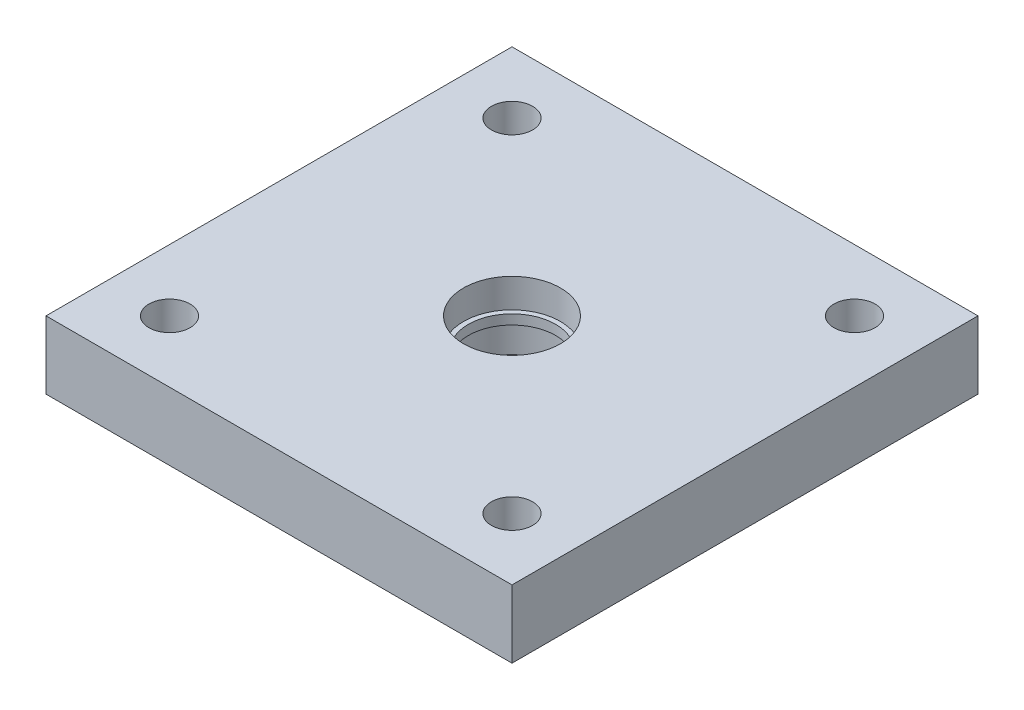
ISO-10303-21;
HEADER;
FILE_DESCRIPTION(('STEP AP214'),'2;1');
FILE_NAME('part.step','',(''),(''),'','','');
FILE_SCHEMA(('AUTOMOTIVE_DESIGN { 1 0 10303 214 1 1 1 1 }'));
ENDSEC;
DATA;
#1=APPLICATION_CONTEXT('core data for automotive mechanical design processes');
#2=APPLICATION_PROTOCOL_DEFINITION('international standard','automotive_design',2000,#1);
#3=PRODUCT_CONTEXT('',#1,'mechanical');
#4=PRODUCT('Part','Part','',(#3));
#5=PRODUCT_RELATED_PRODUCT_CATEGORY('part','',(#4));
#6=PRODUCT_DEFINITION_FORMATION('','',#4);
#7=PRODUCT_DEFINITION_CONTEXT('part definition',#1,'design');
#8=PRODUCT_DEFINITION('design','',#6,#7);
#9=PRODUCT_DEFINITION_SHAPE('','',#8);
#10=(LENGTH_UNIT() NAMED_UNIT(*) SI_UNIT(.MILLI.,.METRE.));
#11=(NAMED_UNIT(*) PLANE_ANGLE_UNIT() SI_UNIT($,.RADIAN.));
#12=(NAMED_UNIT(*) SI_UNIT($,.STERADIAN.) SOLID_ANGLE_UNIT());
#13=UNCERTAINTY_MEASURE_WITH_UNIT(LENGTH_MEASURE(1.E-05),#10,'distance_accuracy_value','');
#14=(GEOMETRIC_REPRESENTATION_CONTEXT(3) GLOBAL_UNCERTAINTY_ASSIGNED_CONTEXT((#13)) GLOBAL_UNIT_ASSIGNED_CONTEXT((#10,
#11,#12)) REPRESENTATION_CONTEXT('',''));
#15=CARTESIAN_POINT('',(0.,0.,0.));
#16=DIRECTION('',(0.,0.,1.));
#17=DIRECTION('',(1.,0.,0.));
#18=AXIS2_PLACEMENT_3D('',#15,#16,#17);
#19=CARTESIAN_POINT('',(0.,14.,0.));
#20=DIRECTION('',(0.,-1.,0.));
#21=DIRECTION('',(0.,0.,-1.));
#22=AXIS2_PLACEMENT_3D('',#19,#20,#21);
#23=CYLINDRICAL_SURFACE('',#22,9.);
#24=CARTESIAN_POINT('',(0.,8.,0.));
#25=DIRECTION('',(0.,1.,0.));
#26=DIRECTION('',(0.,0.,1.));
#27=AXIS2_PLACEMENT_3D('',#24,#25,#26);
#28=CIRCLE('',#27,9.);
#29=CARTESIAN_POINT('',(0.,8.,9.00000000000001));
#30=VERTEX_POINT('',#29);
#31=EDGE_CURVE('E109',#30,#30,#28,.T.);
#32=ORIENTED_EDGE('',*,*,#31,.T.);
#33=EDGE_LOOP('',(#32));
#34=FACE_BOUND('',#33,.T.);
#35=CARTESIAN_POINT('',(0.,6.,0.));
#36=DIRECTION('',(0.,-1.,0.));
#37=DIRECTION('',(0.,0.,-1.));
#38=AXIS2_PLACEMENT_3D('',#35,#36,#37);
#39=CIRCLE('',#38,9.);
#40=CARTESIAN_POINT('',(0.,6.,-8.99999999999999));
#41=VERTEX_POINT('',#40);
#42=EDGE_CURVE('E37',#41,#41,#39,.T.);
#43=ORIENTED_EDGE('',*,*,#42,.T.);
#44=EDGE_LOOP('',(#43));
#45=FACE_BOUND('',#44,.T.);
#46=ADVANCED_FACE('F33',(#34,#45),#23,.F.);
#47=CARTESIAN_POINT('',(0.,14.,0.));
#48=DIRECTION('',(0.,1.,0.));
#49=DIRECTION('',(0.,0.,1.));
#50=AXIS2_PLACEMENT_3D('',#47,#48,#49);
#51=PLANE('',#50);
#52=CARTESIAN_POINT('',(0.,14.,0.));
#53=DIRECTION('',(0.,1.,0.));
#54=DIRECTION('',(0.,0.,1.));
#55=AXIS2_PLACEMENT_3D('',#52,#53,#54);
#56=CIRCLE('',#55,10.);
#57=CARTESIAN_POINT('',(0.,14.,10.));
#58=VERTEX_POINT('',#57);
#59=EDGE_CURVE('E119',#58,#58,#56,.T.);
#60=ORIENTED_EDGE('',*,*,#59,.F.);
#61=EDGE_LOOP('',(#60));
#62=FACE_BOUND('',#61,.T.);
#63=CARTESIAN_POINT('',(35.3553390593274,14.,35.3553390593274));
#64=DIRECTION('',(0.,1.,0.));
#65=DIRECTION('',(0.,0.,1.));
#66=AXIS2_PLACEMENT_3D('',#63,#64,#65);
#67=CIRCLE('',#66,4.25000000000031);
#68=CARTESIAN_POINT('',(35.3553390593274,14.,39.6053390593277));
#69=VERTEX_POINT('',#68);
#70=EDGE_CURVE('E132',#69,#69,#67,.T.);
#71=ORIENTED_EDGE('',*,*,#70,.F.);
#72=EDGE_LOOP('',(#71));
#73=FACE_BOUND('',#72,.T.);
#74=DIRECTION('',(0.,0.,-1.));
#75=VECTOR('',#74,1.);
#76=CARTESIAN_POINT('',(48.1053390593274,14.,-48.1053390593274));
#77=LINE('',#76,#75);
#78=CARTESIAN_POINT('',(48.1053390593274,14.,48.1053390593274));
#79=VERTEX_POINT('',#78);
#80=CARTESIAN_POINT('',(48.1053390593274,14.,-48.1053390593274));
#81=VERTEX_POINT('',#80);
#82=EDGE_CURVE('E88',#79,#81,#77,.T.);
#83=ORIENTED_EDGE('',*,*,#82,.T.);
#84=DIRECTION('',(-1.,0.,0.));
#85=VECTOR('',#84,1.);
#86=CARTESIAN_POINT('',(-48.1053390593274,14.,-48.1053390593274));
#87=LINE('',#86,#85);
#88=CARTESIAN_POINT('',(-48.1053390593274,14.,-48.1053390593274));
#89=VERTEX_POINT('',#88);
#90=EDGE_CURVE('E82',#81,#89,#87,.T.);
#91=ORIENTED_EDGE('',*,*,#90,.T.);
#92=DIRECTION('',(0.,0.,1.));
#93=VECTOR('',#92,1.);
#94=CARTESIAN_POINT('',(-48.1053390593274,14.,-48.1053390593274));
#95=LINE('',#94,#93);
#96=CARTESIAN_POINT('',(-48.1053390593274,14.,48.1053390593274));
#97=VERTEX_POINT('',#96);
#98=EDGE_CURVE('E86',#89,#97,#95,.T.);
#99=ORIENTED_EDGE('',*,*,#98,.T.);
#100=DIRECTION('',(1.,0.,0.));
#101=VECTOR('',#100,1.);
#102=CARTESIAN_POINT('',(-48.1053390593274,14.,48.1053390593274));
#103=LINE('',#102,#101);
#104=EDGE_CURVE('E52',#97,#79,#103,.T.);
#105=ORIENTED_EDGE('',*,*,#104,.T.);
#106=EDGE_LOOP('',(#83,#91,#99,#105));
#107=FACE_BOUND('',#106,.T.);
#108=CARTESIAN_POINT('',(-35.3553390593274,14.,-35.3553390593274));
#109=DIRECTION('',(0.,1.,0.));
#110=DIRECTION('',(0.,0.,1.));
#111=AXIS2_PLACEMENT_3D('',#108,#109,#110);
#112=CIRCLE('',#111,4.25);
#113=CARTESIAN_POINT('',(-35.3553390593274,14.,-31.1053390593274));
#114=VERTEX_POINT('',#113);
#115=EDGE_CURVE('E104',#114,#114,#112,.T.);
#116=ORIENTED_EDGE('',*,*,#115,.F.);
#117=EDGE_LOOP('',(#116));
#118=FACE_BOUND('',#117,.T.);
#119=CARTESIAN_POINT('',(35.3553390593274,14.,-35.3553390593274));
#120=DIRECTION('',(0.,1.,0.));
#121=DIRECTION('',(0.,0.,1.));
#122=AXIS2_PLACEMENT_3D('',#119,#120,#121);
#123=CIRCLE('',#122,4.25000000000015);
#124=CARTESIAN_POINT('',(35.3553390593274,14.,-31.1053390593272));
#125=VERTEX_POINT('',#124);
#126=EDGE_CURVE('E138',#125,#125,#123,.T.);
#127=ORIENTED_EDGE('',*,*,#126,.F.);
#128=EDGE_LOOP('',(#127));
#129=FACE_BOUND('',#128,.T.);
#130=CARTESIAN_POINT('',(-35.3553390593274,14.,35.3553390593274));
#131=DIRECTION('',(0.,1.,0.));
#132=DIRECTION('',(0.,0.,1.));
#133=AXIS2_PLACEMENT_3D('',#130,#131,#132);
#134=CIRCLE('',#133,4.25000000000047);
#135=CARTESIAN_POINT('',(-35.3553390593274,14.,39.6053390593279));
#136=VERTEX_POINT('',#135);
#137=EDGE_CURVE('E116',#136,#136,#134,.T.);
#138=ORIENTED_EDGE('',*,*,#137,.F.);
#139=EDGE_LOOP('',(#138));
#140=FACE_BOUND('',#139,.T.);
#141=ADVANCED_FACE('F83',(#62,#73,#107,#118,#129,#140),#51,.T.);
#142=CARTESIAN_POINT('',(0.,0.,0.));
#143=DIRECTION('',(0.,1.,0.));
#144=DIRECTION('',(0.,0.,1.));
#145=AXIS2_PLACEMENT_3D('',#142,#143,#144);
#146=PLANE('',#145);
#147=CARTESIAN_POINT('',(15.,0.,0.));
#148=DIRECTION('',(0.,-1.,0.));
#149=DIRECTION('',(0.,0.,-1.));
#150=AXIS2_PLACEMENT_3D('',#147,#148,#149);
#151=CIRCLE('',#150,2.);
#152=CARTESIAN_POINT('',(15.,0.,-2.));
#153=VERTEX_POINT('',#152);
#154=EDGE_CURVE('E235',#153,#153,#151,.T.);
#155=ORIENTED_EDGE('',*,*,#154,.F.);
#156=EDGE_LOOP('',(#155));
#157=FACE_BOUND('',#156,.T.);
#158=CARTESIAN_POINT('',(0.,0.,15.));
#159=DIRECTION('',(0.,-1.,0.));
#160=DIRECTION('',(0.,0.,-1.));
#161=AXIS2_PLACEMENT_3D('',#158,#159,#160);
#162=CIRCLE('',#161,2.);
#163=CARTESIAN_POINT('',(0.,0.,13.));
#164=VERTEX_POINT('',#163);
#165=EDGE_CURVE('E234',#164,#164,#162,.T.);
#166=ORIENTED_EDGE('',*,*,#165,.F.);
#167=EDGE_LOOP('',(#166));
#168=FACE_BOUND('',#167,.T.);
#169=CARTESIAN_POINT('',(-15.,0.,0.));
#170=DIRECTION('',(0.,-1.,0.));
#171=DIRECTION('',(0.,0.,-1.));
#172=AXIS2_PLACEMENT_3D('',#169,#170,#171);
#173=CIRCLE('',#172,2.);
#174=CARTESIAN_POINT('',(-15.,0.,-2.));
#175=VERTEX_POINT('',#174);
#176=EDGE_CURVE('E244',#175,#175,#173,.T.);
#177=ORIENTED_EDGE('',*,*,#176,.F.);
#178=EDGE_LOOP('',(#177));
#179=FACE_BOUND('',#178,.T.);
#180=CARTESIAN_POINT('',(0.,0.,-15.));
#181=DIRECTION('',(0.,-1.,0.));
#182=DIRECTION('',(0.,0.,-1.));
#183=AXIS2_PLACEMENT_3D('',#180,#181,#182);
#184=CIRCLE('',#183,2.);
#185=CARTESIAN_POINT('',(0.,0.,-17.));
#186=VERTEX_POINT('',#185);
#187=EDGE_CURVE('E249',#186,#186,#184,.T.);
#188=ORIENTED_EDGE('',*,*,#187,.F.);
#189=EDGE_LOOP('',(#188));
#190=FACE_BOUND('',#189,.T.);
#191=CARTESIAN_POINT('',(0.,0.,0.));
#192=DIRECTION('',(0.,-1.,0.));
#193=DIRECTION('',(0.,0.,-1.));
#194=AXIS2_PLACEMENT_3D('',#191,#192,#193);
#195=CIRCLE('',#194,10.);
#196=CARTESIAN_POINT('',(0.,0.,-9.99999999999999));
#197=VERTEX_POINT('',#196);
#198=EDGE_CURVE('E126',#197,#197,#195,.T.);
#199=ORIENTED_EDGE('',*,*,#198,.F.);
#200=EDGE_LOOP('',(#199));
#201=FACE_BOUND('',#200,.T.);
#202=DIRECTION('',(0.,0.,-1.));
#203=VECTOR('',#202,1.);
#204=CARTESIAN_POINT('',(48.1053390593274,0.,-48.1053390593274));
#205=LINE('',#204,#203);
#206=CARTESIAN_POINT('',(48.1053390593274,0.,48.1053390593274));
#207=VERTEX_POINT('',#206);
#208=CARTESIAN_POINT('',(48.1053390593274,0.,-48.1053390593274));
#209=VERTEX_POINT('',#208);
#210=EDGE_CURVE('E101',#207,#209,#205,.T.);
#211=ORIENTED_EDGE('',*,*,#210,.F.);
#212=DIRECTION('',(1.,0.,0.));
#213=VECTOR('',#212,1.);
#214=CARTESIAN_POINT('',(-48.1053390593274,0.,48.1053390593274));
#215=LINE('',#214,#213);
#216=CARTESIAN_POINT('',(-48.1053390593274,0.,48.1053390593274));
#217=VERTEX_POINT('',#216);
#218=EDGE_CURVE('E75',#217,#207,#215,.T.);
#219=ORIENTED_EDGE('',*,*,#218,.F.);
#220=DIRECTION('',(0.,0.,1.));
#221=VECTOR('',#220,1.);
#222=CARTESIAN_POINT('',(-48.1053390593274,0.,-48.1053390593274));
#223=LINE('',#222,#221);
#224=CARTESIAN_POINT('',(-48.1053390593274,0.,-48.1053390593274));
#225=VERTEX_POINT('',#224);
#226=EDGE_CURVE('E69',#225,#217,#223,.T.);
#227=ORIENTED_EDGE('',*,*,#226,.F.);
#228=DIRECTION('',(-1.,0.,0.));
#229=VECTOR('',#228,1.);
#230=CARTESIAN_POINT('',(-48.1053390593274,0.,-48.1053390593274));
#231=LINE('',#230,#229);
#232=EDGE_CURVE('E92',#209,#225,#231,.T.);
#233=ORIENTED_EDGE('',*,*,#232,.F.);
#234=EDGE_LOOP('',(#211,#219,#227,#233));
#235=FACE_BOUND('',#234,.T.);
#236=CARTESIAN_POINT('',(-35.3553390593274,0.,-35.3553390593274));
#237=DIRECTION('',(0.,1.,0.));
#238=DIRECTION('',(0.,0.,1.));
#239=AXIS2_PLACEMENT_3D('',#236,#237,#238);
#240=CIRCLE('',#239,4.25);
#241=CARTESIAN_POINT('',(-35.3553390593274,0.,-31.1053390593274));
#242=VERTEX_POINT('',#241);
#243=EDGE_CURVE('E141',#242,#242,#240,.T.);
#244=ORIENTED_EDGE('',*,*,#243,.T.);
#245=EDGE_LOOP('',(#244));
#246=FACE_BOUND('',#245,.T.);
#247=CARTESIAN_POINT('',(35.3553390593274,0.,-35.3553390593274));
#248=DIRECTION('',(0.,1.,0.));
#249=DIRECTION('',(0.,0.,1.));
#250=AXIS2_PLACEMENT_3D('',#247,#248,#249);
#251=CIRCLE('',#250,4.25000000000015);
#252=CARTESIAN_POINT('',(35.3553390593274,0.,-31.1053390593272));
#253=VERTEX_POINT('',#252);
#254=EDGE_CURVE('E135',#253,#253,#251,.T.);
#255=ORIENTED_EDGE('',*,*,#254,.T.);
#256=EDGE_LOOP('',(#255));
#257=FACE_BOUND('',#256,.T.);
#258=CARTESIAN_POINT('',(35.3553390593274,0.,35.3553390593274));
#259=DIRECTION('',(0.,1.,0.));
#260=DIRECTION('',(0.,0.,1.));
#261=AXIS2_PLACEMENT_3D('',#258,#259,#260);
#262=CIRCLE('',#261,4.25000000000031);
#263=CARTESIAN_POINT('',(35.3553390593274,0.,39.6053390593277));
#264=VERTEX_POINT('',#263);
#265=EDGE_CURVE('E130',#264,#264,#262,.T.);
#266=ORIENTED_EDGE('',*,*,#265,.T.);
#267=EDGE_LOOP('',(#266));
#268=FACE_BOUND('',#267,.T.);
#269=CARTESIAN_POINT('',(-35.3553390593274,0.,35.3553390593274));
#270=DIRECTION('',(0.,1.,0.));
#271=DIRECTION('',(0.,0.,1.));
#272=AXIS2_PLACEMENT_3D('',#269,#270,#271);
#273=CIRCLE('',#272,4.25000000000047);
#274=CARTESIAN_POINT('',(-35.3553390593274,0.,39.6053390593279));
#275=VERTEX_POINT('',#274);
#276=EDGE_CURVE('E111',#275,#275,#273,.T.);
#277=ORIENTED_EDGE('',*,*,#276,.T.);
#278=EDGE_LOOP('',(#277));
#279=FACE_BOUND('',#278,.T.);
#280=ADVANCED_FACE('F149',(#157,#168,#179,#190,#201,#235,#246,#257,#268,#279),#146,.F.);
#281=CARTESIAN_POINT('',(48.1053390593274,14.,-48.1053390593274));
#282=DIRECTION('',(-1.,0.,0.));
#283=DIRECTION('',(0.,0.,1.));
#284=AXIS2_PLACEMENT_3D('',#281,#282,#283);
#285=PLANE('',#284);
#286=ORIENTED_EDGE('',*,*,#210,.T.);
#287=DIRECTION('',(0.,-1.,0.));
#288=VECTOR('',#287,1.);
#289=CARTESIAN_POINT('',(48.1053390593274,14.,-48.1053390593274));
#290=LINE('',#289,#288);
#291=EDGE_CURVE('E11',#81,#209,#290,.T.);
#292=ORIENTED_EDGE('',*,*,#291,.F.);
#293=ORIENTED_EDGE('',*,*,#82,.F.);
#294=DIRECTION('',(0.,-1.,0.));
#295=VECTOR('',#294,1.);
#296=CARTESIAN_POINT('',(48.1053390593274,14.,48.1053390593274));
#297=LINE('',#296,#295);
#298=EDGE_CURVE('E97',#79,#207,#297,.T.);
#299=ORIENTED_EDGE('',*,*,#298,.T.);
#300=EDGE_LOOP('',(#286,#292,#293,#299));
#301=FACE_BOUND('',#300,.T.);
#302=ADVANCED_FACE('F35',(#301),#285,.F.);
#303=CARTESIAN_POINT('',(-48.1053390593274,14.,-48.1053390593274));
#304=DIRECTION('',(0.,0.,1.));
#305=DIRECTION('',(1.,0.,0.));
#306=AXIS2_PLACEMENT_3D('',#303,#304,#305);
#307=PLANE('',#306);
#308=ORIENTED_EDGE('',*,*,#232,.T.);
#309=DIRECTION('',(0.,-1.,0.));
#310=VECTOR('',#309,1.);
#311=CARTESIAN_POINT('',(-48.1053390593274,14.,-48.1053390593274));
#312=LINE('',#311,#310);
#313=EDGE_CURVE('E43',#89,#225,#312,.T.);
#314=ORIENTED_EDGE('',*,*,#313,.F.);
#315=ORIENTED_EDGE('',*,*,#90,.F.);
#316=ORIENTED_EDGE('',*,*,#291,.T.);
#317=EDGE_LOOP('',(#308,#314,#315,#316));
#318=FACE_BOUND('',#317,.T.);
#319=ADVANCED_FACE('F91',(#318),#307,.F.);
#320=CARTESIAN_POINT('',(-48.1053390593274,14.,-48.1053390593274));
#321=DIRECTION('',(1.,0.,0.));
#322=DIRECTION('',(0.,0.,-1.));
#323=AXIS2_PLACEMENT_3D('',#320,#321,#322);
#324=PLANE('',#323);
#325=ORIENTED_EDGE('',*,*,#226,.T.);
#326=DIRECTION('',(0.,-1.,0.));
#327=VECTOR('',#326,1.);
#328=CARTESIAN_POINT('',(-48.1053390593274,14.,48.1053390593274));
#329=LINE('',#328,#327);
#330=EDGE_CURVE('E93',#97,#217,#329,.T.);
#331=ORIENTED_EDGE('',*,*,#330,.F.);
#332=ORIENTED_EDGE('',*,*,#98,.F.);
#333=ORIENTED_EDGE('',*,*,#313,.T.);
#334=EDGE_LOOP('',(#325,#331,#332,#333));
#335=FACE_BOUND('',#334,.T.);
#336=ADVANCED_FACE('F95',(#335),#324,.F.);
#337=CARTESIAN_POINT('',(-48.1053390593274,14.,48.1053390593274));
#338=DIRECTION('',(0.,0.,-1.));
#339=DIRECTION('',(-1.,0.,0.));
#340=AXIS2_PLACEMENT_3D('',#337,#338,#339);
#341=PLANE('',#340);
#342=ORIENTED_EDGE('',*,*,#218,.T.);
#343=ORIENTED_EDGE('',*,*,#298,.F.);
#344=ORIENTED_EDGE('',*,*,#104,.F.);
#345=ORIENTED_EDGE('',*,*,#330,.T.);
#346=EDGE_LOOP('',(#342,#343,#344,#345));
#347=FACE_BOUND('',#346,.T.);
#348=ADVANCED_FACE('F155',(#347),#341,.F.);
#349=CARTESIAN_POINT('',(-35.3553390593274,14.,-35.3553390593274));
#350=DIRECTION('',(0.,-1.,0.));
#351=DIRECTION('',(0.,0.,-1.));
#352=AXIS2_PLACEMENT_3D('',#349,#350,#351);
#353=CYLINDRICAL_SURFACE('',#352,4.25);
#354=ORIENTED_EDGE('',*,*,#115,.T.);
#355=EDGE_LOOP('',(#354));
#356=FACE_BOUND('',#355,.T.);
#357=ORIENTED_EDGE('',*,*,#243,.F.);
#358=EDGE_LOOP('',(#357));
#359=FACE_BOUND('',#358,.T.);
#360=ADVANCED_FACE('F152',(#356,#359),#353,.F.);
#361=CARTESIAN_POINT('',(35.3553390593274,14.,-35.3553390593274));
#362=DIRECTION('',(0.,-1.,0.));
#363=DIRECTION('',(0.,0.,-1.));
#364=AXIS2_PLACEMENT_3D('',#361,#362,#363);
#365=CYLINDRICAL_SURFACE('',#364,4.25000000000015);
#366=ORIENTED_EDGE('',*,*,#126,.T.);
#367=EDGE_LOOP('',(#366));
#368=FACE_BOUND('',#367,.T.);
#369=ORIENTED_EDGE('',*,*,#254,.F.);
#370=EDGE_LOOP('',(#369));
#371=FACE_BOUND('',#370,.T.);
#372=ADVANCED_FACE('F154',(#368,#371),#365,.F.);
#373=CARTESIAN_POINT('',(35.3553390593274,14.,35.3553390593274));
#374=DIRECTION('',(0.,-1.,0.));
#375=DIRECTION('',(0.,0.,-1.));
#376=AXIS2_PLACEMENT_3D('',#373,#374,#375);
#377=CYLINDRICAL_SURFACE('',#376,4.25000000000031);
#378=ORIENTED_EDGE('',*,*,#70,.T.);
#379=EDGE_LOOP('',(#378));
#380=FACE_BOUND('',#379,.T.);
#381=ORIENTED_EDGE('',*,*,#265,.F.);
#382=EDGE_LOOP('',(#381));
#383=FACE_BOUND('',#382,.T.);
#384=ADVANCED_FACE('F162',(#380,#383),#377,.F.);
#385=CARTESIAN_POINT('',(-35.3553390593274,14.,35.3553390593274));
#386=DIRECTION('',(0.,-1.,0.));
#387=DIRECTION('',(0.,0.,-1.));
#388=AXIS2_PLACEMENT_3D('',#385,#386,#387);
#389=CYLINDRICAL_SURFACE('',#388,4.25000000000047);
#390=ORIENTED_EDGE('',*,*,#137,.T.);
#391=EDGE_LOOP('',(#390));
#392=FACE_BOUND('',#391,.T.);
#393=ORIENTED_EDGE('',*,*,#276,.F.);
#394=EDGE_LOOP('',(#393));
#395=FACE_BOUND('',#394,.T.);
#396=ADVANCED_FACE('F177',(#392,#395),#389,.F.);
#397=CARTESIAN_POINT('',(0.,8.,0.));
#398=DIRECTION('',(0.,1.,0.));
#399=DIRECTION('',(0.,0.,1.));
#400=AXIS2_PLACEMENT_3D('',#397,#398,#399);
#401=CYLINDRICAL_SURFACE('',#400,10.);
#402=CARTESIAN_POINT('',(0.,8.,0.));
#403=DIRECTION('',(0.,1.,0.));
#404=DIRECTION('',(0.,0.,1.));
#405=AXIS2_PLACEMENT_3D('',#402,#403,#404);
#406=CIRCLE('',#405,10.);
#407=CARTESIAN_POINT('',(0.,8.,10.));
#408=VERTEX_POINT('',#407);
#409=EDGE_CURVE('E112',#408,#408,#406,.T.);
#410=ORIENTED_EDGE('',*,*,#409,.F.);
#411=EDGE_LOOP('',(#410));
#412=FACE_BOUND('',#411,.T.);
#413=ORIENTED_EDGE('',*,*,#59,.T.);
#414=EDGE_LOOP('',(#413));
#415=FACE_BOUND('',#414,.T.);
#416=ADVANCED_FACE('F181',(#412,#415),#401,.F.);
#417=CARTESIAN_POINT('',(0.,8.,0.));
#418=DIRECTION('',(0.,1.,0.));
#419=DIRECTION('',(0.,0.,1.));
#420=AXIS2_PLACEMENT_3D('',#417,#418,#419);
#421=PLANE('',#420);
#422=ORIENTED_EDGE('',*,*,#31,.F.);
#423=EDGE_LOOP('',(#422));
#424=FACE_BOUND('',#423,.T.);
#425=ORIENTED_EDGE('',*,*,#409,.T.);
#426=EDGE_LOOP('',(#425));
#427=FACE_BOUND('',#426,.T.);
#428=ADVANCED_FACE('F185',(#424,#427),#421,.T.);
#429=CARTESIAN_POINT('',(0.,6.,0.));
#430=DIRECTION('',(0.,-1.,0.));
#431=DIRECTION('',(0.,0.,-1.));
#432=AXIS2_PLACEMENT_3D('',#429,#430,#431);
#433=CYLINDRICAL_SURFACE('',#432,10.);
#434=CARTESIAN_POINT('',(0.,6.,0.));
#435=DIRECTION('',(0.,-1.,0.));
#436=DIRECTION('',(0.,0.,-1.));
#437=AXIS2_PLACEMENT_3D('',#434,#435,#436);
#438=CIRCLE('',#437,10.);
#439=CARTESIAN_POINT('',(0.,6.,-9.99999999999999));
#440=VERTEX_POINT('',#439);
#441=EDGE_CURVE('E256',#440,#440,#438,.T.);
#442=ORIENTED_EDGE('',*,*,#441,.F.);
#443=EDGE_LOOP('',(#442));
#444=FACE_BOUND('',#443,.T.);
#445=ORIENTED_EDGE('',*,*,#198,.T.);
#446=EDGE_LOOP('',(#445));
#447=FACE_BOUND('',#446,.T.);
#448=ADVANCED_FACE('F189',(#444,#447),#433,.F.);
#449=CARTESIAN_POINT('',(0.,6.,0.));
#450=DIRECTION('',(0.,-1.,0.));
#451=DIRECTION('',(0.,0.,-1.));
#452=AXIS2_PLACEMENT_3D('',#449,#450,#451);
#453=PLANE('',#452);
#454=ORIENTED_EDGE('',*,*,#42,.F.);
#455=EDGE_LOOP('',(#454));
#456=FACE_BOUND('',#455,.T.);
#457=ORIENTED_EDGE('',*,*,#441,.T.);
#458=EDGE_LOOP('',(#457));
#459=FACE_BOUND('',#458,.T.);
#460=ADVANCED_FACE('F193',(#456,#459),#453,.T.);
#461=CARTESIAN_POINT('',(0.,10.,-15.));
#462=DIRECTION('',(0.,-1.,0.));
#463=DIRECTION('',(0.,0.,-1.));
#464=AXIS2_PLACEMENT_3D('',#461,#462,#463);
#465=CYLINDRICAL_SURFACE('',#464,2.);
#466=CARTESIAN_POINT('',(0.,10.,-15.));
#467=DIRECTION('',(0.,-1.,0.));
#468=DIRECTION('',(0.,0.,-1.));
#469=AXIS2_PLACEMENT_3D('',#466,#467,#468);
#470=CIRCLE('',#469,2.);
#471=CARTESIAN_POINT('',(0.,10.,-17.));
#472=VERTEX_POINT('',#471);
#473=EDGE_CURVE('E252',#472,#472,#470,.T.);
#474=ORIENTED_EDGE('',*,*,#473,.F.);
#475=EDGE_LOOP('',(#474));
#476=FACE_BOUND('',#475,.T.);
#477=ORIENTED_EDGE('',*,*,#187,.T.);
#478=EDGE_LOOP('',(#477));
#479=FACE_BOUND('',#478,.T.);
#480=ADVANCED_FACE('F197',(#476,#479),#465,.F.);
#481=CARTESIAN_POINT('',(0.,10.,-15.));
#482=DIRECTION('',(0.,-1.,0.));
#483=DIRECTION('',(0.,0.,-1.));
#484=AXIS2_PLACEMENT_3D('',#481,#482,#483);
#485=PLANE('',#484);
#486=ORIENTED_EDGE('',*,*,#473,.T.);
#487=EDGE_LOOP('',(#486));
#488=FACE_BOUND('',#487,.T.);
#489=ADVANCED_FACE('F201',(#488),#485,.T.);
#490=CARTESIAN_POINT('',(-15.,10.,0.));
#491=DIRECTION('',(0.,-1.,0.));
#492=DIRECTION('',(0.,0.,-1.));
#493=AXIS2_PLACEMENT_3D('',#490,#491,#492);
#494=CYLINDRICAL_SURFACE('',#493,2.);
#495=CARTESIAN_POINT('',(-15.,10.,0.));
#496=DIRECTION('',(0.,-1.,0.));
#497=DIRECTION('',(0.,0.,-1.));
#498=AXIS2_PLACEMENT_3D('',#495,#496,#497);
#499=CIRCLE('',#498,2.);
#500=CARTESIAN_POINT('',(-15.,10.,-2.));
#501=VERTEX_POINT('',#500);
#502=EDGE_CURVE('E246',#501,#501,#499,.T.);
#503=ORIENTED_EDGE('',*,*,#502,.F.);
#504=EDGE_LOOP('',(#503));
#505=FACE_BOUND('',#504,.T.);
#506=ORIENTED_EDGE('',*,*,#176,.T.);
#507=EDGE_LOOP('',(#506));
#508=FACE_BOUND('',#507,.T.);
#509=ADVANCED_FACE('F205',(#505,#508),#494,.F.);
#510=CARTESIAN_POINT('',(-15.,10.,0.));
#511=DIRECTION('',(0.,-1.,0.));
#512=DIRECTION('',(0.,0.,-1.));
#513=AXIS2_PLACEMENT_3D('',#510,#511,#512);
#514=PLANE('',#513);
#515=ORIENTED_EDGE('',*,*,#502,.T.);
#516=EDGE_LOOP('',(#515));
#517=FACE_BOUND('',#516,.T.);
#518=ADVANCED_FACE('F209',(#517),#514,.T.);
#519=CARTESIAN_POINT('',(0.,10.,15.));
#520=DIRECTION('',(0.,-1.,0.));
#521=DIRECTION('',(0.,0.,-1.));
#522=AXIS2_PLACEMENT_3D('',#519,#520,#521);
#523=CYLINDRICAL_SURFACE('',#522,2.);
#524=CARTESIAN_POINT('',(0.,10.,15.));
#525=DIRECTION('',(0.,-1.,0.));
#526=DIRECTION('',(0.,0.,-1.));
#527=AXIS2_PLACEMENT_3D('',#524,#525,#526);
#528=CIRCLE('',#527,2.);
#529=CARTESIAN_POINT('',(0.,10.,13.));
#530=VERTEX_POINT('',#529);
#531=EDGE_CURVE('E238',#530,#530,#528,.T.);
#532=ORIENTED_EDGE('',*,*,#531,.F.);
#533=EDGE_LOOP('',(#532));
#534=FACE_BOUND('',#533,.T.);
#535=ORIENTED_EDGE('',*,*,#165,.T.);
#536=EDGE_LOOP('',(#535));
#537=FACE_BOUND('',#536,.T.);
#538=ADVANCED_FACE('F213',(#534,#537),#523,.F.);
#539=CARTESIAN_POINT('',(0.,10.,15.));
#540=DIRECTION('',(0.,-1.,0.));
#541=DIRECTION('',(0.,0.,-1.));
#542=AXIS2_PLACEMENT_3D('',#539,#540,#541);
#543=PLANE('',#542);
#544=ORIENTED_EDGE('',*,*,#531,.T.);
#545=EDGE_LOOP('',(#544));
#546=FACE_BOUND('',#545,.T.);
#547=ADVANCED_FACE('F217',(#546),#543,.T.);
#548=CARTESIAN_POINT('',(15.,10.,0.));
#549=DIRECTION('',(0.,-1.,0.));
#550=DIRECTION('',(0.,0.,-1.));
#551=AXIS2_PLACEMENT_3D('',#548,#549,#550);
#552=CYLINDRICAL_SURFACE('',#551,2.);
#553=CARTESIAN_POINT('',(15.,10.,0.));
#554=DIRECTION('',(0.,-1.,0.));
#555=DIRECTION('',(0.,0.,-1.));
#556=AXIS2_PLACEMENT_3D('',#553,#554,#555);
#557=CIRCLE('',#556,2.);
#558=CARTESIAN_POINT('',(15.,10.,-2.));
#559=VERTEX_POINT('',#558);
#560=EDGE_CURVE('E233',#559,#559,#557,.T.);
#561=ORIENTED_EDGE('',*,*,#560,.F.);
#562=EDGE_LOOP('',(#561));
#563=FACE_BOUND('',#562,.T.);
#564=ORIENTED_EDGE('',*,*,#154,.T.);
#565=EDGE_LOOP('',(#564));
#566=FACE_BOUND('',#565,.T.);
#567=ADVANCED_FACE('F221',(#563,#566),#552,.F.);
#568=CARTESIAN_POINT('',(15.,10.,0.));
#569=DIRECTION('',(0.,-1.,0.));
#570=DIRECTION('',(0.,0.,-1.));
#571=AXIS2_PLACEMENT_3D('',#568,#569,#570);
#572=PLANE('',#571);
#573=ORIENTED_EDGE('',*,*,#560,.T.);
#574=EDGE_LOOP('',(#573));
#575=FACE_BOUND('',#574,.T.);
#576=ADVANCED_FACE('F225',(#575),#572,.T.);
#577=CLOSED_SHELL('',(#46,#141,#280,#302,#319,#336,#348,#360,#372,#384,#396,#416,#428,#448,#460,
#480,#489,#509,#518,#538,#547,#567,#576));
#578=MANIFOLD_SOLID_BREP('B2',#577);
#579=ADVANCED_BREP_SHAPE_REPRESENTATION('',(#18,#578),#14);
#580=SHAPE_DEFINITION_REPRESENTATION(#9,#579);
ENDSEC;
END-ISO-10303-21;
